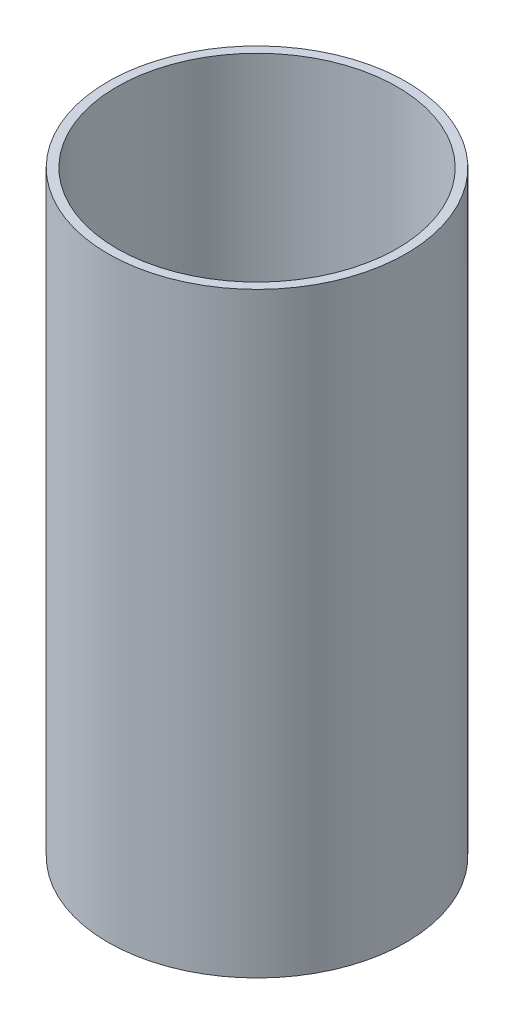
ISO-10303-21;
HEADER;
FILE_DESCRIPTION(('STEP AP214'),'2;1');
FILE_NAME('part.step','',(''),(''),'','','');
FILE_SCHEMA(('AUTOMOTIVE_DESIGN { 1 0 10303 214 1 1 1 1 }'));
ENDSEC;
DATA;
#1=APPLICATION_CONTEXT('core data for automotive mechanical design processes');
#2=APPLICATION_PROTOCOL_DEFINITION('international standard','automotive_design',2000,#1);
#3=PRODUCT_CONTEXT('',#1,'mechanical');
#4=PRODUCT('Part','Part','',(#3));
#5=PRODUCT_RELATED_PRODUCT_CATEGORY('part','',(#4));
#6=PRODUCT_DEFINITION_FORMATION('','',#4);
#7=PRODUCT_DEFINITION_CONTEXT('part definition',#1,'design');
#8=PRODUCT_DEFINITION('design','',#6,#7);
#9=PRODUCT_DEFINITION_SHAPE('','',#8);
#10=(LENGTH_UNIT() NAMED_UNIT(*) SI_UNIT(.MILLI.,.METRE.));
#11=(NAMED_UNIT(*) PLANE_ANGLE_UNIT() SI_UNIT($,.RADIAN.));
#12=(NAMED_UNIT(*) SI_UNIT($,.STERADIAN.) SOLID_ANGLE_UNIT());
#13=UNCERTAINTY_MEASURE_WITH_UNIT(LENGTH_MEASURE(1.E-05),#10,'distance_accuracy_value','');
#14=(GEOMETRIC_REPRESENTATION_CONTEXT(3) GLOBAL_UNCERTAINTY_ASSIGNED_CONTEXT((#13)) GLOBAL_UNIT_ASSIGNED_CONTEXT((#10,
#11,#12)) REPRESENTATION_CONTEXT('',''));
#15=CARTESIAN_POINT('',(0.,0.,0.));
#16=DIRECTION('',(0.,0.,1.));
#17=DIRECTION('',(1.,0.,0.));
#18=AXIS2_PLACEMENT_3D('',#15,#16,#17);
#19=CARTESIAN_POINT('',(0.,200.,0.));
#20=DIRECTION('',(0.,-1.,0.));
#21=DIRECTION('',(0.,0.,-1.));
#22=AXIS2_PLACEMENT_3D('',#19,#20,#21);
#23=CYLINDRICAL_SURFACE('',#22,50.);
#24=CARTESIAN_POINT('',(0.,200.,0.));
#25=DIRECTION('',(0.,1.,0.));
#26=DIRECTION('',(0.,0.,1.));
#27=AXIS2_PLACEMENT_3D('',#24,#25,#26);
#28=CIRCLE('',#27,50.);
#29=CARTESIAN_POINT('',(0.,200.,50.));
#30=VERTEX_POINT('',#29);
#31=EDGE_CURVE('E10',#30,#30,#28,.T.);
#32=ORIENTED_EDGE('',*,*,#31,.F.);
#33=EDGE_LOOP('',(#32));
#34=FACE_BOUND('',#33,.T.);
#35=CARTESIAN_POINT('',(0.,0.,0.));
#36=DIRECTION('',(0.,1.,0.));
#37=DIRECTION('',(0.,0.,1.));
#38=AXIS2_PLACEMENT_3D('',#35,#36,#37);
#39=CIRCLE('',#38,50.);
#40=CARTESIAN_POINT('',(0.,0.,50.));
#41=VERTEX_POINT('',#40);
#42=EDGE_CURVE('E35',#41,#41,#39,.T.);
#43=ORIENTED_EDGE('',*,*,#42,.T.);
#44=EDGE_LOOP('',(#43));
#45=FACE_BOUND('',#44,.T.);
#46=ADVANCED_FACE('F32',(#34,#45),#23,.T.);
#47=CARTESIAN_POINT('',(0.,200.,0.));
#48=DIRECTION('',(0.,1.,0.));
#49=DIRECTION('',(0.,0.,1.));
#50=AXIS2_PLACEMENT_3D('',#47,#48,#49);
#51=PLANE('',#50);
#52=CARTESIAN_POINT('',(0.,200.,0.));
#53=DIRECTION('',(0.,1.,0.));
#54=DIRECTION('',(0.,0.,1.));
#55=AXIS2_PLACEMENT_3D('',#52,#53,#54);
#56=CIRCLE('',#55,47.);
#57=CARTESIAN_POINT('',(0.,200.,47.));
#58=VERTEX_POINT('',#57);
#59=EDGE_CURVE('E42',#58,#58,#56,.T.);
#60=ORIENTED_EDGE('',*,*,#59,.F.);
#61=EDGE_LOOP('',(#60));
#62=FACE_BOUND('',#61,.T.);
#63=ORIENTED_EDGE('',*,*,#31,.T.);
#64=EDGE_LOOP('',(#63));
#65=FACE_BOUND('',#64,.T.);
#66=ADVANCED_FACE('F53',(#62,#65),#51,.T.);
#67=CARTESIAN_POINT('',(0.,0.,0.));
#68=DIRECTION('',(0.,1.,0.));
#69=DIRECTION('',(0.,0.,1.));
#70=AXIS2_PLACEMENT_3D('',#67,#68,#69);
#71=PLANE('',#70);
#72=CARTESIAN_POINT('',(0.,0.,0.));
#73=DIRECTION('',(0.,1.,0.));
#74=DIRECTION('',(0.,0.,1.));
#75=AXIS2_PLACEMENT_3D('',#72,#73,#74);
#76=CIRCLE('',#75,47.);
#77=CARTESIAN_POINT('',(0.,0.,47.));
#78=VERTEX_POINT('',#77);
#79=EDGE_CURVE('E44',#78,#78,#76,.T.);
#80=ORIENTED_EDGE('',*,*,#79,.T.);
#81=EDGE_LOOP('',(#80));
#82=FACE_BOUND('',#81,.T.);
#83=ORIENTED_EDGE('',*,*,#42,.F.);
#84=EDGE_LOOP('',(#83));
#85=FACE_BOUND('',#84,.T.);
#86=ADVANCED_FACE('F55',(#82,#85),#71,.F.);
#87=CARTESIAN_POINT('',(0.,200.,0.));
#88=DIRECTION('',(0.,-1.,0.));
#89=DIRECTION('',(0.,0.,-1.));
#90=AXIS2_PLACEMENT_3D('',#87,#88,#89);
#91=CYLINDRICAL_SURFACE('',#90,47.);
#92=ORIENTED_EDGE('',*,*,#59,.T.);
#93=EDGE_LOOP('',(#92));
#94=FACE_BOUND('',#93,.T.);
#95=ORIENTED_EDGE('',*,*,#79,.F.);
#96=EDGE_LOOP('',(#95));
#97=FACE_BOUND('',#96,.T.);
#98=ADVANCED_FACE('F50',(#94,#97),#91,.F.);
#99=CLOSED_SHELL('',(#46,#66,#86,#98));
#100=MANIFOLD_SOLID_BREP('B2',#99);
#101=ADVANCED_BREP_SHAPE_REPRESENTATION('',(#18,#100),#14);
#102=SHAPE_DEFINITION_REPRESENTATION(#9,#101);
ENDSEC;
END-ISO-10303-21;
